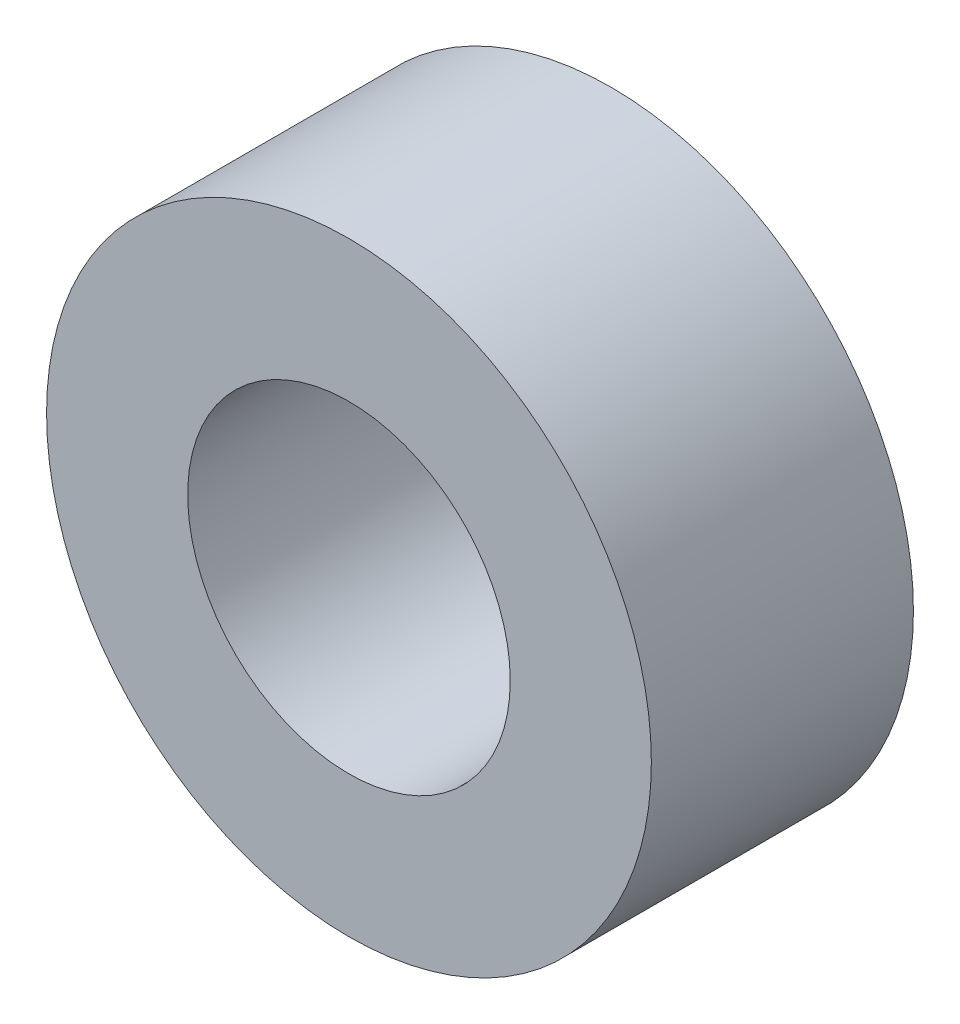
ISO-10303-21;
HEADER;
FILE_DESCRIPTION(('STEP AP214'),'2;1');
FILE_NAME('part.step','',(''),(''),'','','');
FILE_SCHEMA(('AUTOMOTIVE_DESIGN { 1 0 10303 214 1 1 1 1 }'));
ENDSEC;
DATA;
#1=APPLICATION_CONTEXT('core data for automotive mechanical design processes');
#2=APPLICATION_PROTOCOL_DEFINITION('international standard','automotive_design',2000,#1);
#3=PRODUCT_CONTEXT('',#1,'mechanical');
#4=PRODUCT('Part','Part','',(#3));
#5=PRODUCT_RELATED_PRODUCT_CATEGORY('part','',(#4));
#6=PRODUCT_DEFINITION_FORMATION('','',#4);
#7=PRODUCT_DEFINITION_CONTEXT('part definition',#1,'design');
#8=PRODUCT_DEFINITION('design','',#6,#7);
#9=PRODUCT_DEFINITION_SHAPE('','',#8);
#10=(LENGTH_UNIT() NAMED_UNIT(*) SI_UNIT(.MILLI.,.METRE.));
#11=(NAMED_UNIT(*) PLANE_ANGLE_UNIT() SI_UNIT($,.RADIAN.));
#12=(NAMED_UNIT(*) SI_UNIT($,.STERADIAN.) SOLID_ANGLE_UNIT());
#13=UNCERTAINTY_MEASURE_WITH_UNIT(LENGTH_MEASURE(1.E-05),#10,'distance_accuracy_value','');
#14=(GEOMETRIC_REPRESENTATION_CONTEXT(3) GLOBAL_UNCERTAINTY_ASSIGNED_CONTEXT((#13)) GLOBAL_UNIT_ASSIGNED_CONTEXT((#10,
#11,#12)) REPRESENTATION_CONTEXT('',''));
#15=CARTESIAN_POINT('',(0.,0.,0.));
#16=DIRECTION('',(0.,0.,1.));
#17=DIRECTION('',(1.,0.,0.));
#18=AXIS2_PLACEMENT_3D('',#15,#16,#17);
#19=CARTESIAN_POINT('',(0.,0.,6.5));
#20=DIRECTION('',(0.,0.,-1.));
#21=DIRECTION('',(-1.,0.,0.));
#22=AXIS2_PLACEMENT_3D('',#19,#20,#21);
#23=CYLINDRICAL_SURFACE('',#22,7.5);
#24=CARTESIAN_POINT('',(0.,0.,6.5));
#25=DIRECTION('',(0.,0.,1.));
#26=DIRECTION('',(1.,0.,0.));
#27=AXIS2_PLACEMENT_3D('',#24,#25,#26);
#28=CIRCLE('',#27,7.5);
#29=CARTESIAN_POINT('',(-7.5,0.,6.5));
#30=VERTEX_POINT('',#29);
#31=EDGE_CURVE('E10',#30,#30,#28,.T.);
#32=CARTESIAN_POINT('',(0.,0.,0.));
#33=DIRECTION('',(0.,0.,1.));
#34=DIRECTION('',(1.,0.,0.));
#35=AXIS2_PLACEMENT_3D('',#32,#33,#34);
#36=CIRCLE('',#35,7.5);
#37=CARTESIAN_POINT('',(-7.5,0.,0.));
#38=VERTEX_POINT('',#37);
#39=EDGE_CURVE('E34',#38,#38,#36,.T.);
#40=CARTESIAN_POINT('',(-7.5,0.,6.5));
#41=CARTESIAN_POINT('',(-7.5,0.,6.43229166666667));
#42=CARTESIAN_POINT('',(-7.5,0.,6.36458333333333));
#43=CARTESIAN_POINT('',(-7.5,0.,6.22916666666667));
#44=CARTESIAN_POINT('',(-7.5,0.,6.16145833333333));
#45=CARTESIAN_POINT('',(-7.5,0.,6.02604166666667));
#46=CARTESIAN_POINT('',(-7.5,0.,5.95833333333333));
#47=CARTESIAN_POINT('',(-7.5,0.,5.82291666666667));
#48=CARTESIAN_POINT('',(-7.5,0.,5.75520833333333));
#49=CARTESIAN_POINT('',(-7.5,0.,5.61979166666667));
#50=CARTESIAN_POINT('',(-7.5,0.,5.55208333333333));
#51=CARTESIAN_POINT('',(-7.5,0.,5.41666666666667));
#52=CARTESIAN_POINT('',(-7.5,0.,5.34895833333333));
#53=CARTESIAN_POINT('',(-7.5,0.,5.21354166666667));
#54=CARTESIAN_POINT('',(-7.5,0.,5.14583333333333));
#55=CARTESIAN_POINT('',(-7.5,0.,5.01041666666667));
#56=CARTESIAN_POINT('',(-7.5,0.,4.94270833333333));
#57=CARTESIAN_POINT('',(-7.5,0.,4.80729166666667));
#58=CARTESIAN_POINT('',(-7.5,0.,4.73958333333333));
#59=CARTESIAN_POINT('',(-7.5,0.,4.60416666666667));
#60=CARTESIAN_POINT('',(-7.5,0.,4.53645833333333));
#61=CARTESIAN_POINT('',(-7.5,0.,4.40104166666667));
#62=CARTESIAN_POINT('',(-7.5,0.,4.33333333333333));
#63=CARTESIAN_POINT('',(-7.5,0.,4.19791666666667));
#64=CARTESIAN_POINT('',(-7.5,0.,4.13020833333333));
#65=CARTESIAN_POINT('',(-7.5,0.,3.99479166666667));
#66=CARTESIAN_POINT('',(-7.5,0.,3.92708333333333));
#67=CARTESIAN_POINT('',(-7.5,0.,3.79166666666667));
#68=CARTESIAN_POINT('',(-7.5,0.,3.72395833333333));
#69=CARTESIAN_POINT('',(-7.5,0.,3.58854166666667));
#70=CARTESIAN_POINT('',(-7.5,0.,3.52083333333333));
#71=CARTESIAN_POINT('',(-7.5,0.,3.38541666666667));
#72=CARTESIAN_POINT('',(-7.5,0.,3.31770833333333));
#73=CARTESIAN_POINT('',(-7.5,0.,3.18229166666667));
#74=CARTESIAN_POINT('',(-7.5,0.,3.11458333333333));
#75=CARTESIAN_POINT('',(-7.5,0.,2.97916666666667));
#76=CARTESIAN_POINT('',(-7.5,0.,2.91145833333333));
#77=CARTESIAN_POINT('',(-7.5,0.,2.77604166666667));
#78=CARTESIAN_POINT('',(-7.5,0.,2.70833333333333));
#79=CARTESIAN_POINT('',(-7.5,0.,2.57291666666667));
#80=CARTESIAN_POINT('',(-7.5,0.,2.50520833333333));
#81=CARTESIAN_POINT('',(-7.5,0.,2.36979166666667));
#82=CARTESIAN_POINT('',(-7.5,0.,2.30208333333333));
#83=CARTESIAN_POINT('',(-7.5,0.,2.16666666666667));
#84=CARTESIAN_POINT('',(-7.5,0.,2.09895833333333));
#85=CARTESIAN_POINT('',(-7.5,0.,1.96354166666667));
#86=CARTESIAN_POINT('',(-7.5,0.,1.89583333333333));
#87=CARTESIAN_POINT('',(-7.5,0.,1.76041666666667));
#88=CARTESIAN_POINT('',(-7.5,0.,1.69270833333333));
#89=CARTESIAN_POINT('',(-7.5,0.,1.55729166666667));
#90=CARTESIAN_POINT('',(-7.5,0.,1.48958333333333));
#91=CARTESIAN_POINT('',(-7.5,0.,1.35416666666667));
#92=CARTESIAN_POINT('',(-7.5,0.,1.28645833333333));
#93=CARTESIAN_POINT('',(-7.5,0.,1.15104166666667));
#94=CARTESIAN_POINT('',(-7.5,0.,1.08333333333333));
#95=CARTESIAN_POINT('',(-7.5,0.,0.947916666666667));
#96=CARTESIAN_POINT('',(-7.5,0.,0.880208333333333));
#97=CARTESIAN_POINT('',(-7.5,0.,0.744791666666667));
#98=CARTESIAN_POINT('',(-7.5,0.,0.677083333333333));
#99=CARTESIAN_POINT('',(-7.5,0.,0.541666666666667));
#100=CARTESIAN_POINT('',(-7.5,0.,0.473958333333333));
#101=CARTESIAN_POINT('',(-7.5,0.,0.338541666666667));
#102=CARTESIAN_POINT('',(-7.5,0.,0.270833333333334));
#103=CARTESIAN_POINT('',(-7.5,0.,0.135416666666667));
#104=CARTESIAN_POINT('',(-7.5,0.,0.0677083333333334));
#105=CARTESIAN_POINT('',(-7.5,0.,0.));
#106=B_SPLINE_CURVE_WITH_KNOTS('',3,(#40,#41,#42,#43,#44,#45,#46,#47,#48,#49,#50,#51,#52,#53,
#54,#55,#56,#57,#58,#59,#60,#61,#62,#63,#64,#65,#66,#67,#68,#69,#70,#71,#72,#73,#74,#75,#76,#77,
#78,#79,#80,#81,#82,#83,#84,#85,#86,#87,#88,#89,#90,#91,#92,#93,#94,#95,#96,#97,#98,#99,#100,
#101,#102,#103,#104,#105),.UNSPECIFIED.,.F.,.F.,(4,2,2,2,2,2,2,2,2,2,2,2,2,2,2,2,2,2,2,2,2,2,2,
2,2,2,2,2,2,2,2,2,4),(0.,0.203125,0.40625,0.609375000000001,0.812500000000001,1.015625,1.21875,
1.421875,1.625,1.828125,2.03125,2.234375,2.4375,2.640625,2.84375,3.046875,3.25,3.453125,3.65625,
3.859375,4.0625,4.265625,4.46875,4.671875,4.875,5.078125,5.28125,5.484375,5.6875,5.890625,
6.09375,6.296875,6.5),.UNSPECIFIED.);
#107=EDGE_CURVE('BSEAM31',#30,#38,#106,.T.);
#108=ORIENTED_EDGE('',*,*,#31,.F.);
#109=ORIENTED_EDGE('',*,*,#39,.T.);
#110=ORIENTED_EDGE('',*,*,#107,.T.);
#111=ORIENTED_EDGE('',*,*,#107,.F.);
#112=EDGE_LOOP('',(#108,#110,#109,#111));
#113=FACE_BOUND('',#112,.T.);
#114=ADVANCED_FACE('F31',(#113),#23,.T.);
#115=CARTESIAN_POINT('',(0.,0.,6.5));
#116=DIRECTION('',(0.,0.,1.));
#117=DIRECTION('',(1.,0.,0.));
#118=AXIS2_PLACEMENT_3D('',#115,#116,#117);
#119=PLANE('',#118);
#120=CARTESIAN_POINT('',(0.,0.,6.5));
#121=DIRECTION('',(0.,0.,1.));
#122=DIRECTION('',(1.,0.,0.));
#123=AXIS2_PLACEMENT_3D('',#120,#121,#122);
#124=CIRCLE('',#123,4.);
#125=CARTESIAN_POINT('',(4.,0.,6.5));
#126=VERTEX_POINT('',#125);
#127=EDGE_CURVE('E43',#126,#126,#124,.T.);
#128=ORIENTED_EDGE('',*,*,#127,.F.);
#129=EDGE_LOOP('',(#128));
#130=FACE_BOUND('',#129,.T.);
#131=ORIENTED_EDGE('',*,*,#31,.T.);
#132=EDGE_LOOP('',(#131));
#133=FACE_BOUND('',#132,.T.);
#134=ADVANCED_FACE('F58',(#130,#133),#119,.T.);
#135=CARTESIAN_POINT('',(0.,0.,0.));
#136=DIRECTION('',(0.,0.,1.));
#137=DIRECTION('',(1.,0.,0.));
#138=AXIS2_PLACEMENT_3D('',#135,#136,#137);
#139=PLANE('',#138);
#140=CARTESIAN_POINT('',(0.,0.,0.));
#141=DIRECTION('',(0.,0.,1.));
#142=DIRECTION('',(1.,0.,0.));
#143=AXIS2_PLACEMENT_3D('',#140,#141,#142);
#144=CIRCLE('',#143,4.);
#145=CARTESIAN_POINT('',(4.,0.,0.));
#146=VERTEX_POINT('',#145);
#147=EDGE_CURVE('E41',#146,#146,#144,.T.);
#148=ORIENTED_EDGE('',*,*,#147,.T.);
#149=EDGE_LOOP('',(#148));
#150=FACE_BOUND('',#149,.T.);
#151=ORIENTED_EDGE('',*,*,#39,.F.);
#152=EDGE_LOOP('',(#151));
#153=FACE_BOUND('',#152,.T.);
#154=ADVANCED_FACE('F49',(#150,#153),#139,.F.);
#155=CARTESIAN_POINT('',(0.,0.,0.));
#156=DIRECTION('',(0.,0.,1.));
#157=DIRECTION('',(1.,0.,0.));
#158=AXIS2_PLACEMENT_3D('',#155,#156,#157);
#159=CYLINDRICAL_SURFACE('',#158,4.);
#160=CARTESIAN_POINT('',(4.,0.,0.));
#161=CARTESIAN_POINT('',(4.,0.,0.0677083333333332));
#162=CARTESIAN_POINT('',(4.,0.,0.135416666666667));
#163=CARTESIAN_POINT('',(4.,0.,0.270833333333333));
#164=CARTESIAN_POINT('',(4.,0.,0.338541666666667));
#165=CARTESIAN_POINT('',(4.,0.,0.473958333333333));
#166=CARTESIAN_POINT('',(4.,0.,0.541666666666667));
#167=CARTESIAN_POINT('',(4.,0.,0.677083333333333));
#168=CARTESIAN_POINT('',(4.,0.,0.744791666666667));
#169=CARTESIAN_POINT('',(4.,0.,0.880208333333333));
#170=CARTESIAN_POINT('',(4.,0.,0.947916666666667));
#171=CARTESIAN_POINT('',(4.,0.,1.08333333333333));
#172=CARTESIAN_POINT('',(4.,0.,1.15104166666667));
#173=CARTESIAN_POINT('',(4.,0.,1.28645833333333));
#174=CARTESIAN_POINT('',(4.,0.,1.35416666666667));
#175=CARTESIAN_POINT('',(4.,0.,1.48958333333333));
#176=CARTESIAN_POINT('',(4.,0.,1.55729166666667));
#177=CARTESIAN_POINT('',(4.,0.,1.69270833333333));
#178=CARTESIAN_POINT('',(4.,0.,1.76041666666667));
#179=CARTESIAN_POINT('',(4.,0.,1.89583333333333));
#180=CARTESIAN_POINT('',(4.,0.,1.96354166666667));
#181=CARTESIAN_POINT('',(4.,0.,2.09895833333333));
#182=CARTESIAN_POINT('',(4.,0.,2.16666666666667));
#183=CARTESIAN_POINT('',(4.,0.,2.30208333333333));
#184=CARTESIAN_POINT('',(4.,0.,2.36979166666667));
#185=CARTESIAN_POINT('',(4.,0.,2.50520833333333));
#186=CARTESIAN_POINT('',(4.,0.,2.57291666666667));
#187=CARTESIAN_POINT('',(4.,0.,2.70833333333333));
#188=CARTESIAN_POINT('',(4.,0.,2.77604166666667));
#189=CARTESIAN_POINT('',(4.,0.,2.91145833333333));
#190=CARTESIAN_POINT('',(4.,0.,2.97916666666667));
#191=CARTESIAN_POINT('',(4.,0.,3.11458333333333));
#192=CARTESIAN_POINT('',(4.,0.,3.18229166666667));
#193=CARTESIAN_POINT('',(4.,0.,3.31770833333333));
#194=CARTESIAN_POINT('',(4.,0.,3.38541666666667));
#195=CARTESIAN_POINT('',(4.,0.,3.52083333333333));
#196=CARTESIAN_POINT('',(4.,0.,3.58854166666667));
#197=CARTESIAN_POINT('',(4.,0.,3.72395833333333));
#198=CARTESIAN_POINT('',(4.,0.,3.79166666666667));
#199=CARTESIAN_POINT('',(4.,0.,3.92708333333333));
#200=CARTESIAN_POINT('',(4.,0.,3.99479166666667));
#201=CARTESIAN_POINT('',(4.,0.,4.13020833333333));
#202=CARTESIAN_POINT('',(4.,0.,4.19791666666667));
#203=CARTESIAN_POINT('',(4.,0.,4.33333333333333));
#204=CARTESIAN_POINT('',(4.,0.,4.40104166666667));
#205=CARTESIAN_POINT('',(4.,0.,4.53645833333333));
#206=CARTESIAN_POINT('',(4.,0.,4.60416666666667));
#207=CARTESIAN_POINT('',(4.,0.,4.73958333333333));
#208=CARTESIAN_POINT('',(4.,0.,4.80729166666667));
#209=CARTESIAN_POINT('',(4.,0.,4.94270833333333));
#210=CARTESIAN_POINT('',(4.,0.,5.01041666666667));
#211=CARTESIAN_POINT('',(4.,0.,5.14583333333333));
#212=CARTESIAN_POINT('',(4.,0.,5.21354166666667));
#213=CARTESIAN_POINT('',(4.,0.,5.34895833333333));
#214=CARTESIAN_POINT('',(4.,0.,5.41666666666667));
#215=CARTESIAN_POINT('',(4.,0.,5.55208333333333));
#216=CARTESIAN_POINT('',(4.,0.,5.61979166666667));
#217=CARTESIAN_POINT('',(4.,0.,5.75520833333333));
#218=CARTESIAN_POINT('',(4.,0.,5.82291666666667));
#219=CARTESIAN_POINT('',(4.,0.,5.95833333333333));
#220=CARTESIAN_POINT('',(4.,0.,6.02604166666667));
#221=CARTESIAN_POINT('',(4.,0.,6.16145833333333));
#222=CARTESIAN_POINT('',(4.,0.,6.22916666666667));
#223=CARTESIAN_POINT('',(4.,0.,6.36458333333333));
#224=CARTESIAN_POINT('',(4.,0.,6.43229166666667));
#225=CARTESIAN_POINT('',(4.,0.,6.5));
#226=B_SPLINE_CURVE_WITH_KNOTS('',3,(#160,#161,#162,#163,#164,#165,#166,#167,#168,#169,#170,
#171,#172,#173,#174,#175,#176,#177,#178,#179,#180,#181,#182,#183,#184,#185,#186,#187,#188,#189,
#190,#191,#192,#193,#194,#195,#196,#197,#198,#199,#200,#201,#202,#203,#204,#205,#206,#207,#208,
#209,#210,#211,#212,#213,#214,#215,#216,#217,#218,#219,#220,#221,#222,#223,#224,#225),
.UNSPECIFIED.,.F.,.F.,(4,2,2,2,2,2,2,2,2,2,2,2,2,2,2,2,2,2,2,2,2,2,2,2,2,2,2,2,2,2,2,2,4),(0.,
0.203125,0.40625,0.609375,0.8125,1.015625,1.21875,1.421875,1.625,1.828125,2.03125,2.234375,
2.4375,2.640625,2.84375,3.046875,3.25,3.453125,3.65625,3.859375,4.0625,4.265625,4.46875,
4.671875,4.875,5.078125,5.28125,5.484375,5.6875,5.890625,6.09375,6.296875,6.5),.UNSPECIFIED.);
#227=EDGE_CURVE('BSEAM52',#146,#126,#226,.T.);
#228=ORIENTED_EDGE('',*,*,#147,.F.);
#229=ORIENTED_EDGE('',*,*,#127,.T.);
#230=ORIENTED_EDGE('',*,*,#227,.T.);
#231=ORIENTED_EDGE('',*,*,#227,.F.);
#232=EDGE_LOOP('',(#228,#230,#229,#231));
#233=FACE_BOUND('',#232,.T.);
#234=ADVANCED_FACE('F52',(#233),#159,.F.);
#235=CLOSED_SHELL('',(#114,#134,#154,#234));
#236=MANIFOLD_SOLID_BREP('B2',#235);
#237=ADVANCED_BREP_SHAPE_REPRESENTATION('',(#18,#236),#14);
#238=SHAPE_DEFINITION_REPRESENTATION(#9,#237);
ENDSEC;
END-ISO-10303-21;
